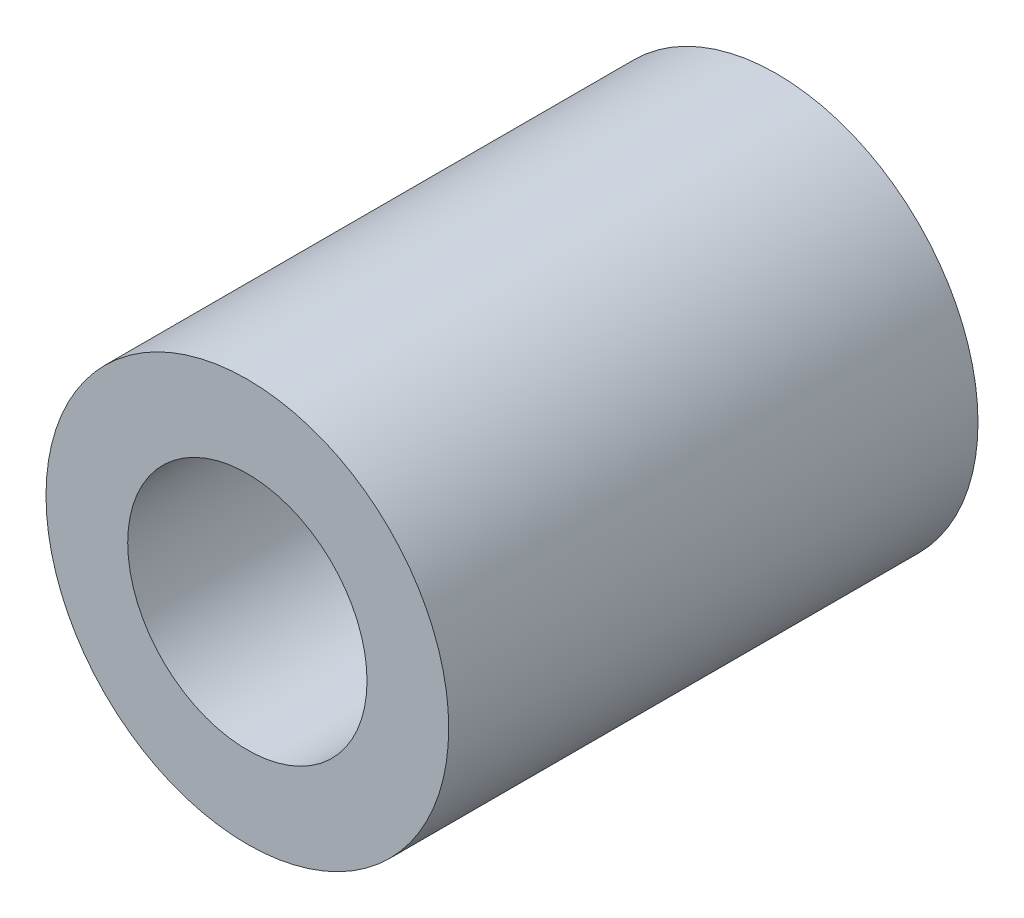
ISO-10303-21;
HEADER;
FILE_DESCRIPTION(('STEP AP214'),'2;1');
FILE_NAME('part.step','',(''),(''),'','','');
FILE_SCHEMA(('AUTOMOTIVE_DESIGN { 1 0 10303 214 1 1 1 1 }'));
ENDSEC;
DATA;
#1=APPLICATION_CONTEXT('core data for automotive mechanical design processes');
#2=APPLICATION_PROTOCOL_DEFINITION('international standard','automotive_design',2000,#1);
#3=PRODUCT_CONTEXT('',#1,'mechanical');
#4=PRODUCT('Part','Part','',(#3));
#5=PRODUCT_RELATED_PRODUCT_CATEGORY('part','',(#4));
#6=PRODUCT_DEFINITION_FORMATION('','',#4);
#7=PRODUCT_DEFINITION_CONTEXT('part definition',#1,'design');
#8=PRODUCT_DEFINITION('design','',#6,#7);
#9=PRODUCT_DEFINITION_SHAPE('','',#8);
#10=(LENGTH_UNIT() NAMED_UNIT(*) SI_UNIT(.MILLI.,.METRE.));
#11=(NAMED_UNIT(*) PLANE_ANGLE_UNIT() SI_UNIT($,.RADIAN.));
#12=(NAMED_UNIT(*) SI_UNIT($,.STERADIAN.) SOLID_ANGLE_UNIT());
#13=UNCERTAINTY_MEASURE_WITH_UNIT(LENGTH_MEASURE(1.E-05),#10,'distance_accuracy_value','');
#14=(GEOMETRIC_REPRESENTATION_CONTEXT(3) GLOBAL_UNCERTAINTY_ASSIGNED_CONTEXT((#13)) GLOBAL_UNIT_ASSIGNED_CONTEXT((#10,
#11,#12)) REPRESENTATION_CONTEXT('',''));
#15=CARTESIAN_POINT('',(0.,0.,0.));
#16=DIRECTION('',(0.,0.,1.));
#17=DIRECTION('',(1.,0.,0.));
#18=AXIS2_PLACEMENT_3D('',#15,#16,#17);
#19=CARTESIAN_POINT('',(0.,0.,14.605));
#20=DIRECTION('',(0.,0.,-1.));
#21=DIRECTION('',(-1.,0.,0.));
#22=AXIS2_PLACEMENT_3D('',#19,#20,#21);
#23=CYLINDRICAL_SURFACE('',#22,3.302);
#24=CARTESIAN_POINT('',(0.,0.,0.));
#25=DIRECTION('',(0.,0.,-1.));
#26=DIRECTION('',(-1.,0.,0.));
#27=AXIS2_PLACEMENT_3D('',#24,#25,#26);
#28=CIRCLE('',#27,3.302);
#29=CARTESIAN_POINT('',(-3.302,0.,0.));
#30=VERTEX_POINT('',#29);
#31=EDGE_CURVE('E27',#30,#30,#28,.T.);
#32=ORIENTED_EDGE('',*,*,#31,.T.);
#33=EDGE_LOOP('',(#32));
#34=FACE_BOUND('',#33,.T.);
#35=CARTESIAN_POINT('',(0.,0.,14.605));
#36=DIRECTION('',(0.,0.,-1.));
#37=DIRECTION('',(-1.,0.,0.));
#38=AXIS2_PLACEMENT_3D('',#35,#36,#37);
#39=CIRCLE('',#38,3.302);
#40=CARTESIAN_POINT('',(-3.302,0.,14.605));
#41=VERTEX_POINT('',#40);
#42=EDGE_CURVE('E18',#41,#41,#39,.T.);
#43=ORIENTED_EDGE('',*,*,#42,.F.);
#44=EDGE_LOOP('',(#43));
#45=FACE_BOUND('',#44,.T.);
#46=ADVANCED_FACE('F15',(#34,#45),#23,.F.);
#47=CARTESIAN_POINT('',(0.,0.,14.605));
#48=DIRECTION('',(0.,0.,1.));
#49=DIRECTION('',(1.,0.,0.));
#50=AXIS2_PLACEMENT_3D('',#47,#48,#49);
#51=PLANE('',#50);
#52=ORIENTED_EDGE('',*,*,#42,.T.);
#53=EDGE_LOOP('',(#52));
#54=FACE_BOUND('',#53,.T.);
#55=CARTESIAN_POINT('',(0.,0.,14.605));
#56=DIRECTION('',(0.,0.,-1.));
#57=DIRECTION('',(-1.,0.,0.));
#58=AXIS2_PLACEMENT_3D('',#55,#56,#57);
#59=CIRCLE('',#58,5.55625);
#60=CARTESIAN_POINT('',(-5.55625,0.,14.605));
#61=VERTEX_POINT('',#60);
#62=EDGE_CURVE('E22',#61,#61,#59,.T.);
#63=ORIENTED_EDGE('',*,*,#62,.F.);
#64=EDGE_LOOP('',(#63));
#65=FACE_BOUND('',#64,.T.);
#66=ADVANCED_FACE('F35',(#54,#65),#51,.T.);
#67=CARTESIAN_POINT('',(0.,0.,0.));
#68=DIRECTION('',(0.,0.,1.));
#69=DIRECTION('',(1.,0.,0.));
#70=AXIS2_PLACEMENT_3D('',#67,#68,#69);
#71=PLANE('',#70);
#72=ORIENTED_EDGE('',*,*,#31,.F.);
#73=EDGE_LOOP('',(#72));
#74=FACE_BOUND('',#73,.T.);
#75=CARTESIAN_POINT('',(0.,0.,0.));
#76=DIRECTION('',(0.,0.,-1.));
#77=DIRECTION('',(-1.,0.,0.));
#78=AXIS2_PLACEMENT_3D('',#75,#76,#77);
#79=CIRCLE('',#78,5.55625);
#80=CARTESIAN_POINT('',(-5.55625,0.,0.));
#81=VERTEX_POINT('',#80);
#82=EDGE_CURVE('E10',#81,#81,#79,.F.);
#83=ORIENTED_EDGE('',*,*,#82,.F.);
#84=EDGE_LOOP('',(#83));
#85=FACE_BOUND('',#84,.T.);
#86=ADVANCED_FACE('F43',(#74,#85),#71,.F.);
#87=CARTESIAN_POINT('',(0.,0.,14.605));
#88=DIRECTION('',(0.,0.,-1.));
#89=DIRECTION('',(-1.,0.,0.));
#90=AXIS2_PLACEMENT_3D('',#87,#88,#89);
#91=CYLINDRICAL_SURFACE('',#90,5.55625);
#92=ORIENTED_EDGE('',*,*,#82,.T.);
#93=EDGE_LOOP('',(#92));
#94=FACE_BOUND('',#93,.T.);
#95=ORIENTED_EDGE('',*,*,#62,.T.);
#96=EDGE_LOOP('',(#95));
#97=FACE_BOUND('',#96,.T.);
#98=ADVANCED_FACE('F44',(#94,#97),#91,.T.);
#99=CLOSED_SHELL('',(#46,#66,#86,#98));
#100=MANIFOLD_SOLID_BREP('B1',#99);
#101=ADVANCED_BREP_SHAPE_REPRESENTATION('',(#18,#100),#14);
#102=SHAPE_DEFINITION_REPRESENTATION(#9,#101);
ENDSEC;
END-ISO-10303-21;
